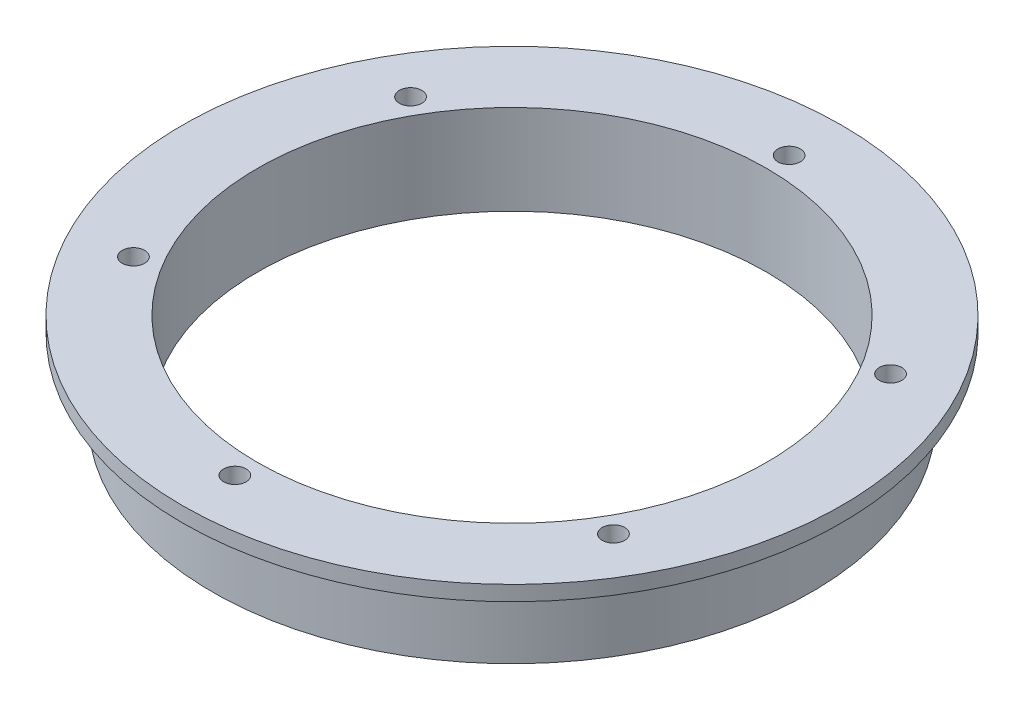
ISO-10303-21;
HEADER;
FILE_DESCRIPTION(('STEP AP214'),'2;1');
FILE_NAME('part.step','',(''),(''),'','','');
FILE_SCHEMA(('AUTOMOTIVE_DESIGN { 1 0 10303 214 1 1 1 1 }'));
ENDSEC;
DATA;
#1=APPLICATION_CONTEXT('core data for automotive mechanical design processes');
#2=APPLICATION_PROTOCOL_DEFINITION('international standard','automotive_design',2000,#1);
#3=PRODUCT_CONTEXT('',#1,'mechanical');
#4=PRODUCT('Part','Part','',(#3));
#5=PRODUCT_RELATED_PRODUCT_CATEGORY('part','',(#4));
#6=PRODUCT_DEFINITION_FORMATION('','',#4);
#7=PRODUCT_DEFINITION_CONTEXT('part definition',#1,'design');
#8=PRODUCT_DEFINITION('design','',#6,#7);
#9=PRODUCT_DEFINITION_SHAPE('','',#8);
#10=(LENGTH_UNIT() NAMED_UNIT(*) SI_UNIT(.MILLI.,.METRE.));
#11=(NAMED_UNIT(*) PLANE_ANGLE_UNIT() SI_UNIT($,.RADIAN.));
#12=(NAMED_UNIT(*) SI_UNIT($,.STERADIAN.) SOLID_ANGLE_UNIT());
#13=UNCERTAINTY_MEASURE_WITH_UNIT(LENGTH_MEASURE(1.E-05),#10,'distance_accuracy_value','');
#14=(GEOMETRIC_REPRESENTATION_CONTEXT(3) GLOBAL_UNCERTAINTY_ASSIGNED_CONTEXT((#13)) GLOBAL_UNIT_ASSIGNED_CONTEXT((#10,
#11,#12)) REPRESENTATION_CONTEXT('',''));
#15=CARTESIAN_POINT('',(0.,0.,0.));
#16=DIRECTION('',(0.,0.,1.));
#17=DIRECTION('',(1.,0.,0.));
#18=AXIS2_PLACEMENT_3D('',#15,#16,#17);
#19=CARTESIAN_POINT('',(44.,12.,0.));
#20=DIRECTION('',(0.,1.,0.));
#21=DIRECTION('',(0.,0.,1.));
#22=AXIS2_PLACEMENT_3D('',#19,#20,#21);
#23=PLANE('',#22);
#24=CARTESIAN_POINT('',(0.,12.,-37.));
#25=DIRECTION('',(0.,1.,0.));
#26=DIRECTION('',(0.,0.,1.));
#27=AXIS2_PLACEMENT_3D('',#24,#25,#26);
#28=CIRCLE('',#27,1.5);
#29=CARTESIAN_POINT('',(0.,12.,-35.5));
#30=VERTEX_POINT('',#29);
#31=EDGE_CURVE('E63',#30,#30,#28,.T.);
#32=ORIENTED_EDGE('',*,*,#31,.F.);
#33=EDGE_LOOP('',(#32));
#34=FACE_BOUND('',#33,.T.);
#35=CARTESIAN_POINT('',(-32.0429399400242,12.,-18.5));
#36=DIRECTION('',(0.,1.,0.));
#37=DIRECTION('',(0.,0.,1.));
#38=AXIS2_PLACEMENT_3D('',#35,#36,#37);
#39=CIRCLE('',#38,1.5);
#40=CARTESIAN_POINT('',(-32.0429399400242,12.,-17.));
#41=VERTEX_POINT('',#40);
#42=EDGE_CURVE('E69',#41,#41,#39,.T.);
#43=ORIENTED_EDGE('',*,*,#42,.F.);
#44=EDGE_LOOP('',(#43));
#45=FACE_BOUND('',#44,.T.);
#46=CARTESIAN_POINT('',(-32.0429399400242,12.,18.5));
#47=DIRECTION('',(0.,1.,0.));
#48=DIRECTION('',(0.,0.,1.));
#49=AXIS2_PLACEMENT_3D('',#46,#47,#48);
#50=CIRCLE('',#49,1.5);
#51=CARTESIAN_POINT('',(-32.0429399400242,12.,20.));
#52=VERTEX_POINT('',#51);
#53=EDGE_CURVE('E68',#52,#52,#50,.T.);
#54=ORIENTED_EDGE('',*,*,#53,.F.);
#55=EDGE_LOOP('',(#54));
#56=FACE_BOUND('',#55,.T.);
#57=CARTESIAN_POINT('',(0.,12.,37.));
#58=DIRECTION('',(0.,1.,0.));
#59=DIRECTION('',(0.,0.,1.));
#60=AXIS2_PLACEMENT_3D('',#57,#58,#59);
#61=CIRCLE('',#60,1.5);
#62=CARTESIAN_POINT('',(0.,12.,38.5));
#63=VERTEX_POINT('',#62);
#64=EDGE_CURVE('E73',#63,#63,#61,.T.);
#65=ORIENTED_EDGE('',*,*,#64,.F.);
#66=EDGE_LOOP('',(#65));
#67=FACE_BOUND('',#66,.T.);
#68=CARTESIAN_POINT('',(32.0429399400242,12.,18.5));
#69=DIRECTION('',(0.,1.,0.));
#70=DIRECTION('',(0.,0.,1.));
#71=AXIS2_PLACEMENT_3D('',#68,#69,#70);
#72=CIRCLE('',#71,1.5);
#73=CARTESIAN_POINT('',(32.0429399400242,12.,20.));
#74=VERTEX_POINT('',#73);
#75=EDGE_CURVE('E82',#74,#74,#72,.T.);
#76=ORIENTED_EDGE('',*,*,#75,.F.);
#77=EDGE_LOOP('',(#76));
#78=FACE_BOUND('',#77,.T.);
#79=CARTESIAN_POINT('',(32.0429399400242,12.,-18.5));
#80=DIRECTION('',(0.,1.,0.));
#81=DIRECTION('',(0.,0.,1.));
#82=AXIS2_PLACEMENT_3D('',#79,#80,#81);
#83=CIRCLE('',#82,1.5);
#84=CARTESIAN_POINT('',(32.0429399400242,12.,-17.));
#85=VERTEX_POINT('',#84);
#86=EDGE_CURVE('E87',#85,#85,#83,.T.);
#87=ORIENTED_EDGE('',*,*,#86,.F.);
#88=EDGE_LOOP('',(#87));
#89=FACE_BOUND('',#88,.T.);
#90=CARTESIAN_POINT('',(0.,12.,0.));
#91=DIRECTION('',(0.,-1.,0.));
#92=DIRECTION('',(0.,0.,-1.));
#93=AXIS2_PLACEMENT_3D('',#90,#91,#92);
#94=CIRCLE('',#93,34.);
#95=CARTESIAN_POINT('',(0.,12.,-34.));
#96=VERTEX_POINT('',#95);
#97=EDGE_CURVE('E10',#96,#96,#94,.T.);
#98=ORIENTED_EDGE('',*,*,#97,.T.);
#99=EDGE_LOOP('',(#98));
#100=FACE_BOUND('',#99,.T.);
#101=CARTESIAN_POINT('',(0.,12.,0.));
#102=DIRECTION('',(0.,-1.,0.));
#103=DIRECTION('',(0.,0.,-1.));
#104=AXIS2_PLACEMENT_3D('',#101,#102,#103);
#105=CIRCLE('',#104,44.);
#106=CARTESIAN_POINT('',(0.,12.,-44.));
#107=VERTEX_POINT('',#106);
#108=EDGE_CURVE('E61',#107,#107,#105,.T.);
#109=ORIENTED_EDGE('',*,*,#108,.F.);
#110=EDGE_LOOP('',(#109));
#111=FACE_BOUND('',#110,.T.);
#112=ADVANCED_FACE('F39',(#34,#45,#56,#67,#78,#89,#100,#111),#23,.T.);
#113=CARTESIAN_POINT('',(0.,0.,0.));
#114=DIRECTION('',(0.,-1.,0.));
#115=DIRECTION('',(0.,0.,-1.));
#116=AXIS2_PLACEMENT_3D('',#113,#114,#115);
#117=CYLINDRICAL_SURFACE('',#116,34.);
#118=CARTESIAN_POINT('',(0.,0.,0.));
#119=DIRECTION('',(0.,-1.,0.));
#120=DIRECTION('',(0.,0.,-1.));
#121=AXIS2_PLACEMENT_3D('',#118,#119,#120);
#122=CIRCLE('',#121,34.);
#123=CARTESIAN_POINT('',(0.,0.,-34.));
#124=VERTEX_POINT('',#123);
#125=EDGE_CURVE('E44',#124,#124,#122,.T.);
#126=ORIENTED_EDGE('',*,*,#125,.T.);
#127=EDGE_LOOP('',(#126));
#128=FACE_BOUND('',#127,.T.);
#129=ORIENTED_EDGE('',*,*,#97,.F.);
#130=EDGE_LOOP('',(#129));
#131=FACE_BOUND('',#130,.T.);
#132=ADVANCED_FACE('F106',(#128,#131),#117,.F.);
#133=CARTESIAN_POINT('',(34.,0.,0.));
#134=DIRECTION('',(0.,-1.,0.));
#135=DIRECTION('',(0.,0.,-1.));
#136=AXIS2_PLACEMENT_3D('',#133,#134,#135);
#137=PLANE('',#136);
#138=CARTESIAN_POINT('',(0.,0.,-37.));
#139=DIRECTION('',(0.,1.,0.));
#140=DIRECTION('',(0.,0.,1.));
#141=AXIS2_PLACEMENT_3D('',#138,#139,#140);
#142=CIRCLE('',#141,1.5);
#143=CARTESIAN_POINT('',(0.,0.,-35.5));
#144=VERTEX_POINT('',#143);
#145=EDGE_CURVE('E89',#144,#144,#142,.T.);
#146=ORIENTED_EDGE('',*,*,#145,.T.);
#147=EDGE_LOOP('',(#146));
#148=FACE_BOUND('',#147,.T.);
#149=CARTESIAN_POINT('',(-32.0429399400242,0.,-18.5));
#150=DIRECTION('',(0.,1.,0.));
#151=DIRECTION('',(0.,0.,1.));
#152=AXIS2_PLACEMENT_3D('',#149,#150,#151);
#153=CIRCLE('',#152,1.5);
#154=CARTESIAN_POINT('',(-32.0429399400242,0.,-17.));
#155=VERTEX_POINT('',#154);
#156=EDGE_CURVE('E93',#155,#155,#153,.T.);
#157=ORIENTED_EDGE('',*,*,#156,.T.);
#158=EDGE_LOOP('',(#157));
#159=FACE_BOUND('',#158,.T.);
#160=CARTESIAN_POINT('',(-32.0429399400242,0.,18.5));
#161=DIRECTION('',(0.,1.,0.));
#162=DIRECTION('',(0.,0.,1.));
#163=AXIS2_PLACEMENT_3D('',#160,#161,#162);
#164=CIRCLE('',#163,1.5);
#165=CARTESIAN_POINT('',(-32.0429399400242,0.,20.));
#166=VERTEX_POINT('',#165);
#167=EDGE_CURVE('E65',#166,#166,#164,.T.);
#168=ORIENTED_EDGE('',*,*,#167,.T.);
#169=EDGE_LOOP('',(#168));
#170=FACE_BOUND('',#169,.T.);
#171=CARTESIAN_POINT('',(0.,0.,37.));
#172=DIRECTION('',(0.,1.,0.));
#173=DIRECTION('',(0.,0.,1.));
#174=AXIS2_PLACEMENT_3D('',#171,#172,#173);
#175=CIRCLE('',#174,1.5);
#176=CARTESIAN_POINT('',(0.,0.,38.5));
#177=VERTEX_POINT('',#176);
#178=EDGE_CURVE('E75',#177,#177,#175,.T.);
#179=ORIENTED_EDGE('',*,*,#178,.T.);
#180=EDGE_LOOP('',(#179));
#181=FACE_BOUND('',#180,.T.);
#182=CARTESIAN_POINT('',(32.0429399400242,0.,18.5));
#183=DIRECTION('',(0.,1.,0.));
#184=DIRECTION('',(0.,0.,1.));
#185=AXIS2_PLACEMENT_3D('',#182,#183,#184);
#186=CIRCLE('',#185,1.5);
#187=CARTESIAN_POINT('',(32.0429399400242,0.,20.));
#188=VERTEX_POINT('',#187);
#189=EDGE_CURVE('E79',#188,#188,#186,.T.);
#190=ORIENTED_EDGE('',*,*,#189,.T.);
#191=EDGE_LOOP('',(#190));
#192=FACE_BOUND('',#191,.T.);
#193=CARTESIAN_POINT('',(32.0429399400242,0.,-18.5));
#194=DIRECTION('',(0.,1.,0.));
#195=DIRECTION('',(0.,0.,1.));
#196=AXIS2_PLACEMENT_3D('',#193,#194,#195);
#197=CIRCLE('',#196,1.5);
#198=CARTESIAN_POINT('',(32.0429399400242,0.,-17.));
#199=VERTEX_POINT('',#198);
#200=EDGE_CURVE('E84',#199,#199,#197,.T.);
#201=ORIENTED_EDGE('',*,*,#200,.T.);
#202=EDGE_LOOP('',(#201));
#203=FACE_BOUND('',#202,.T.);
#204=CARTESIAN_POINT('',(0.,0.,0.));
#205=DIRECTION('',(0.,-1.,0.));
#206=DIRECTION('',(0.,0.,-1.));
#207=AXIS2_PLACEMENT_3D('',#204,#205,#206);
#208=CIRCLE('',#207,40.);
#209=CARTESIAN_POINT('',(0.,0.,-40.));
#210=VERTEX_POINT('',#209);
#211=EDGE_CURVE('E47',#210,#210,#208,.T.);
#212=ORIENTED_EDGE('',*,*,#211,.T.);
#213=EDGE_LOOP('',(#212));
#214=FACE_BOUND('',#213,.T.);
#215=ORIENTED_EDGE('',*,*,#125,.F.);
#216=EDGE_LOOP('',(#215));
#217=FACE_BOUND('',#216,.T.);
#218=ADVANCED_FACE('F135',(#148,#159,#170,#181,#192,#203,#214,#217),#137,.T.);
#219=CARTESIAN_POINT('',(0.,0.,0.));
#220=DIRECTION('',(0.,-1.,0.));
#221=DIRECTION('',(0.,0.,-1.));
#222=AXIS2_PLACEMENT_3D('',#219,#220,#221);
#223=CYLINDRICAL_SURFACE('',#222,40.);
#224=CARTESIAN_POINT('',(0.,10.,0.));
#225=DIRECTION('',(0.,-1.,0.));
#226=DIRECTION('',(0.,0.,-1.));
#227=AXIS2_PLACEMENT_3D('',#224,#225,#226);
#228=CIRCLE('',#227,40.);
#229=CARTESIAN_POINT('',(0.,10.,-40.));
#230=VERTEX_POINT('',#229);
#231=EDGE_CURVE('E52',#230,#230,#228,.T.);
#232=ORIENTED_EDGE('',*,*,#231,.T.);
#233=EDGE_LOOP('',(#232));
#234=FACE_BOUND('',#233,.T.);
#235=ORIENTED_EDGE('',*,*,#211,.F.);
#236=EDGE_LOOP('',(#235));
#237=FACE_BOUND('',#236,.T.);
#238=ADVANCED_FACE('F129',(#234,#237),#223,.T.);
#239=CARTESIAN_POINT('',(40.,10.,0.));
#240=DIRECTION('',(0.,-1.,0.));
#241=DIRECTION('',(0.,0.,-1.));
#242=AXIS2_PLACEMENT_3D('',#239,#240,#241);
#243=PLANE('',#242);
#244=CARTESIAN_POINT('',(0.,10.,0.));
#245=DIRECTION('',(0.,-1.,0.));
#246=DIRECTION('',(0.,0.,-1.));
#247=AXIS2_PLACEMENT_3D('',#244,#245,#246);
#248=CIRCLE('',#247,44.);
#249=CARTESIAN_POINT('',(0.,10.,-44.));
#250=VERTEX_POINT('',#249);
#251=EDGE_CURVE('E59',#250,#250,#248,.T.);
#252=ORIENTED_EDGE('',*,*,#251,.T.);
#253=EDGE_LOOP('',(#252));
#254=FACE_BOUND('',#253,.T.);
#255=ORIENTED_EDGE('',*,*,#231,.F.);
#256=EDGE_LOOP('',(#255));
#257=FACE_BOUND('',#256,.T.);
#258=ADVANCED_FACE('F123',(#254,#257),#243,.T.);
#259=CARTESIAN_POINT('',(0.,0.,0.));
#260=DIRECTION('',(0.,-1.,0.));
#261=DIRECTION('',(0.,0.,-1.));
#262=AXIS2_PLACEMENT_3D('',#259,#260,#261);
#263=CYLINDRICAL_SURFACE('',#262,44.);
#264=ORIENTED_EDGE('',*,*,#108,.T.);
#265=EDGE_LOOP('',(#264));
#266=FACE_BOUND('',#265,.T.);
#267=ORIENTED_EDGE('',*,*,#251,.F.);
#268=EDGE_LOOP('',(#267));
#269=FACE_BOUND('',#268,.T.);
#270=ADVANCED_FACE('F118',(#266,#269),#263,.T.);
#271=CARTESIAN_POINT('',(32.0429399400242,12.,-18.5));
#272=DIRECTION('',(0.,-1.,0.));
#273=DIRECTION('',(0.,0.,-1.));
#274=AXIS2_PLACEMENT_3D('',#271,#272,#273);
#275=CYLINDRICAL_SURFACE('',#274,1.5);
#276=ORIENTED_EDGE('',*,*,#86,.T.);
#277=EDGE_LOOP('',(#276));
#278=FACE_BOUND('',#277,.T.);
#279=ORIENTED_EDGE('',*,*,#200,.F.);
#280=EDGE_LOOP('',(#279));
#281=FACE_BOUND('',#280,.T.);
#282=ADVANCED_FACE('F125',(#278,#281),#275,.F.);
#283=CARTESIAN_POINT('',(32.0429399400242,12.,18.5));
#284=DIRECTION('',(0.,-1.,0.));
#285=DIRECTION('',(0.,0.,-1.));
#286=AXIS2_PLACEMENT_3D('',#283,#284,#285);
#287=CYLINDRICAL_SURFACE('',#286,1.5);
#288=ORIENTED_EDGE('',*,*,#75,.T.);
#289=EDGE_LOOP('',(#288));
#290=FACE_BOUND('',#289,.T.);
#291=ORIENTED_EDGE('',*,*,#189,.F.);
#292=EDGE_LOOP('',(#291));
#293=FACE_BOUND('',#292,.T.);
#294=ADVANCED_FACE('F160',(#290,#293),#287,.F.);
#295=CARTESIAN_POINT('',(0.,12.,37.));
#296=DIRECTION('',(0.,-1.,0.));
#297=DIRECTION('',(0.,0.,-1.));
#298=AXIS2_PLACEMENT_3D('',#295,#296,#297);
#299=CYLINDRICAL_SURFACE('',#298,1.5);
#300=ORIENTED_EDGE('',*,*,#64,.T.);
#301=EDGE_LOOP('',(#300));
#302=FACE_BOUND('',#301,.T.);
#303=ORIENTED_EDGE('',*,*,#178,.F.);
#304=EDGE_LOOP('',(#303));
#305=FACE_BOUND('',#304,.T.);
#306=ADVANCED_FACE('F153',(#302,#305),#299,.F.);
#307=CARTESIAN_POINT('',(-32.0429399400242,12.,18.5));
#308=DIRECTION('',(0.,-1.,0.));
#309=DIRECTION('',(0.,0.,-1.));
#310=AXIS2_PLACEMENT_3D('',#307,#308,#309);
#311=CYLINDRICAL_SURFACE('',#310,1.5);
#312=ORIENTED_EDGE('',*,*,#53,.T.);
#313=EDGE_LOOP('',(#312));
#314=FACE_BOUND('',#313,.T.);
#315=ORIENTED_EDGE('',*,*,#167,.F.);
#316=EDGE_LOOP('',(#315));
#317=FACE_BOUND('',#316,.T.);
#318=ADVANCED_FACE('F149',(#314,#317),#311,.F.);
#319=CARTESIAN_POINT('',(-32.0429399400242,12.,-18.5));
#320=DIRECTION('',(0.,-1.,0.));
#321=DIRECTION('',(0.,0.,-1.));
#322=AXIS2_PLACEMENT_3D('',#319,#320,#321);
#323=CYLINDRICAL_SURFACE('',#322,1.5);
#324=ORIENTED_EDGE('',*,*,#42,.T.);
#325=EDGE_LOOP('',(#324));
#326=FACE_BOUND('',#325,.T.);
#327=ORIENTED_EDGE('',*,*,#156,.F.);
#328=EDGE_LOOP('',(#327));
#329=FACE_BOUND('',#328,.T.);
#330=ADVANCED_FACE('F155',(#326,#329),#323,.F.);
#331=CARTESIAN_POINT('',(0.,12.,-37.));
#332=DIRECTION('',(0.,-1.,0.));
#333=DIRECTION('',(0.,0.,-1.));
#334=AXIS2_PLACEMENT_3D('',#331,#332,#333);
#335=CYLINDRICAL_SURFACE('',#334,1.5);
#336=ORIENTED_EDGE('',*,*,#31,.T.);
#337=EDGE_LOOP('',(#336));
#338=FACE_BOUND('',#337,.T.);
#339=ORIENTED_EDGE('',*,*,#145,.F.);
#340=EDGE_LOOP('',(#339));
#341=FACE_BOUND('',#340,.T.);
#342=ADVANCED_FACE('F101',(#338,#341),#335,.F.);
#343=CLOSED_SHELL('',(#112,#132,#218,#238,#258,#270,#282,#294,#306,#318,#330,#342));
#344=MANIFOLD_SOLID_BREP('B2',#343);
#345=ADVANCED_BREP_SHAPE_REPRESENTATION('',(#18,#344),#14);
#346=SHAPE_DEFINITION_REPRESENTATION(#9,#345);
ENDSEC;
END-ISO-10303-21;
